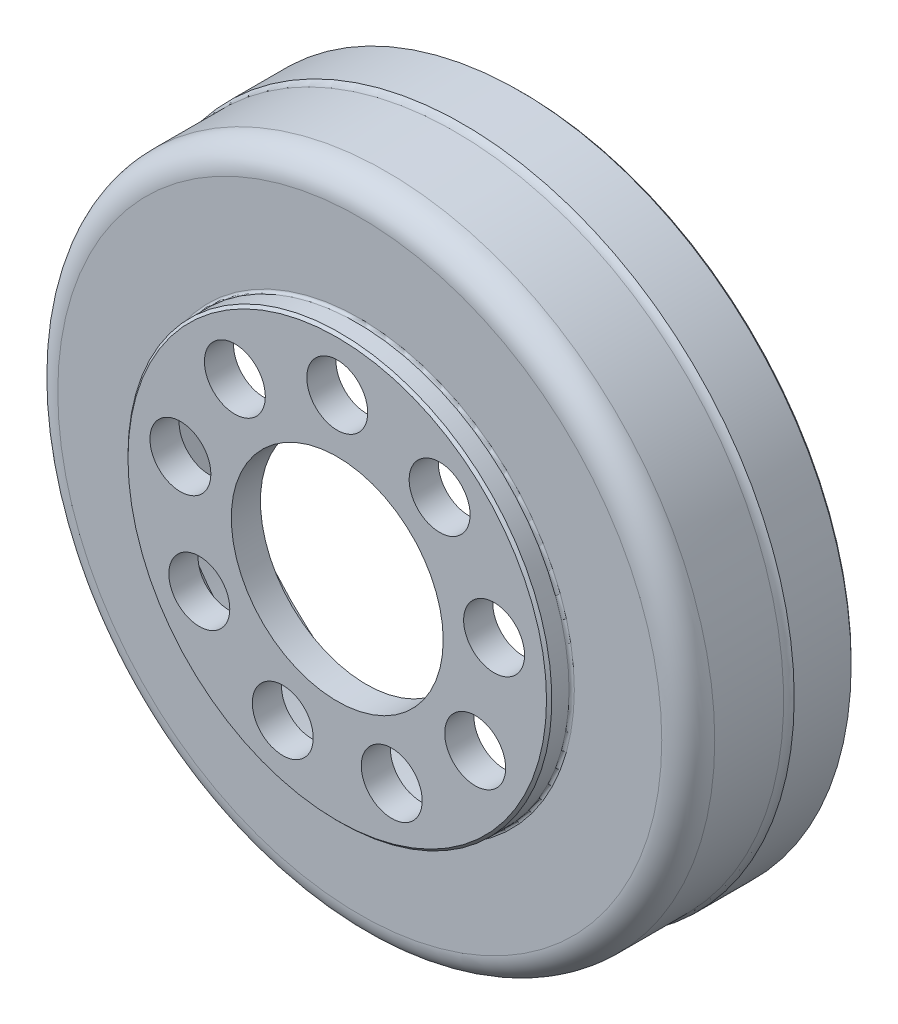
ISO-10303-21;
HEADER;
FILE_DESCRIPTION(('STEP AP214'),'2;1');
FILE_NAME('part.step','',(''),(''),'','','');
FILE_SCHEMA(('AUTOMOTIVE_DESIGN { 1 0 10303 214 1 1 1 1 }'));
ENDSEC;
DATA;
#1=APPLICATION_CONTEXT('core data for automotive mechanical design processes');
#2=APPLICATION_PROTOCOL_DEFINITION('international standard','automotive_design',2000,#1);
#3=PRODUCT_CONTEXT('',#1,'mechanical');
#4=PRODUCT('Part','Part','',(#3));
#5=PRODUCT_RELATED_PRODUCT_CATEGORY('part','',(#4));
#6=PRODUCT_DEFINITION_FORMATION('','',#4);
#7=PRODUCT_DEFINITION_CONTEXT('part definition',#1,'design');
#8=PRODUCT_DEFINITION('design','',#6,#7);
#9=PRODUCT_DEFINITION_SHAPE('','',#8);
#10=(LENGTH_UNIT() NAMED_UNIT(*) SI_UNIT(.MILLI.,.METRE.));
#11=(NAMED_UNIT(*) PLANE_ANGLE_UNIT() SI_UNIT($,.RADIAN.));
#12=(NAMED_UNIT(*) SI_UNIT($,.STERADIAN.) SOLID_ANGLE_UNIT());
#13=UNCERTAINTY_MEASURE_WITH_UNIT(LENGTH_MEASURE(1.E-05),#10,'distance_accuracy_value','');
#14=(GEOMETRIC_REPRESENTATION_CONTEXT(3) GLOBAL_UNCERTAINTY_ASSIGNED_CONTEXT((#13)) GLOBAL_UNIT_ASSIGNED_CONTEXT((#10,
#11,#12)) REPRESENTATION_CONTEXT('',''));
#15=CARTESIAN_POINT('',(0.,0.,0.));
#16=DIRECTION('',(0.,0.,1.));
#17=DIRECTION('',(1.,0.,0.));
#18=AXIS2_PLACEMENT_3D('',#15,#16,#17);
#19=CARTESIAN_POINT('',(0.,0.,4.5));
#20=DIRECTION('',(0.,0.,-1.));
#21=DIRECTION('',(-1.,0.,0.));
#22=AXIS2_PLACEMENT_3D('',#19,#20,#21);
#23=CYLINDRICAL_SURFACE('',#22,25.);
#24=CARTESIAN_POINT('',(0.,0.,0.199999999999995));
#25=DIRECTION('',(0.,0.,1.));
#26=DIRECTION('',(1.,0.,0.));
#27=AXIS2_PLACEMENT_3D('',#24,#25,#26);
#28=CIRCLE('',#27,25.);
#29=CARTESIAN_POINT('',(25.,0.,0.199999999999995));
#30=VERTEX_POINT('',#29);
#31=EDGE_CURVE('E55',#30,#30,#28,.T.);
#32=ORIENTED_EDGE('',*,*,#31,.T.);
#33=EDGE_LOOP('',(#32));
#34=FACE_BOUND('',#33,.T.);
#35=CARTESIAN_POINT('',(0.,0.,4.5));
#36=DIRECTION('',(0.,0.,1.));
#37=DIRECTION('',(1.,0.,0.));
#38=AXIS2_PLACEMENT_3D('',#35,#36,#37);
#39=CIRCLE('',#38,25.);
#40=CARTESIAN_POINT('',(25.,0.,4.5));
#41=VERTEX_POINT('',#40);
#42=EDGE_CURVE('E67',#41,#41,#39,.T.);
#43=ORIENTED_EDGE('',*,*,#42,.F.);
#44=EDGE_LOOP('',(#43));
#45=FACE_BOUND('',#44,.T.);
#46=ADVANCED_FACE('F32',(#34,#45),#23,.T.);
#47=CARTESIAN_POINT('',(0.,0.,0.));
#48=DIRECTION('',(0.,0.,1.));
#49=DIRECTION('',(1.,0.,0.));
#50=AXIS2_PLACEMENT_3D('',#47,#48,#49);
#51=PLANE('',#50);
#52=CARTESIAN_POINT('',(0.,0.,0.));
#53=DIRECTION('',(0.,0.,1.));
#54=DIRECTION('',(1.,0.,0.));
#55=AXIS2_PLACEMENT_3D('',#52,#53,#54);
#56=CIRCLE('',#55,24.8);
#57=CARTESIAN_POINT('',(24.8,0.,0.));
#58=VERTEX_POINT('',#57);
#59=EDGE_CURVE('E52',#58,#58,#56,.F.);
#60=ORIENTED_EDGE('',*,*,#59,.T.);
#61=EDGE_LOOP('',(#60));
#62=FACE_BOUND('',#61,.T.);
#63=CARTESIAN_POINT('',(0.,0.,0.));
#64=DIRECTION('',(0.,0.,1.));
#65=DIRECTION('',(1.,0.,0.));
#66=AXIS2_PLACEMENT_3D('',#63,#64,#65);
#67=CIRCLE('',#66,24.5);
#68=CARTESIAN_POINT('',(24.5,0.,0.));
#69=VERTEX_POINT('',#68);
#70=EDGE_CURVE('E71',#69,#69,#67,.T.);
#71=ORIENTED_EDGE('',*,*,#70,.T.);
#72=EDGE_LOOP('',(#71));
#73=FACE_BOUND('',#72,.T.);
#74=ADVANCED_FACE('F170',(#62,#73),#51,.F.);
#75=CARTESIAN_POINT('',(0.,0.,12.3));
#76=DIRECTION('',(0.,0.,-1.));
#77=DIRECTION('',(-1.,0.,0.));
#78=AXIS2_PLACEMENT_3D('',#75,#76,#77);
#79=CYLINDRICAL_SURFACE('',#78,24.8);
#80=CARTESIAN_POINT('',(0.,0.,5.10000000000001));
#81=DIRECTION('',(0.,0.,-1.));
#82=DIRECTION('',(-1.,0.,0.));
#83=AXIS2_PLACEMENT_3D('',#80,#81,#82);
#84=CIRCLE('',#83,24.8);
#85=CARTESIAN_POINT('',(-24.8,0.,5.10000000000001));
#86=VERTEX_POINT('',#85);
#87=EDGE_CURVE('E58',#86,#86,#84,.F.);
#88=ORIENTED_EDGE('',*,*,#87,.T.);
#89=EDGE_LOOP('',(#88));
#90=FACE_BOUND('',#89,.T.);
#91=CARTESIAN_POINT('',(0.,0.,10.3));
#92=DIRECTION('',(0.,0.,1.));
#93=DIRECTION('',(1.,0.,0.));
#94=AXIS2_PLACEMENT_3D('',#91,#92,#93);
#95=CIRCLE('',#94,24.8);
#96=CARTESIAN_POINT('',(24.8,0.,10.3));
#97=VERTEX_POINT('',#96);
#98=EDGE_CURVE('E61',#97,#97,#95,.F.);
#99=ORIENTED_EDGE('',*,*,#98,.T.);
#100=EDGE_LOOP('',(#99));
#101=FACE_BOUND('',#100,.T.);
#102=ADVANCED_FACE('F176',(#90,#101),#79,.T.);
#103=CARTESIAN_POINT('',(0.,0.,12.3));
#104=DIRECTION('',(0.,0.,1.));
#105=DIRECTION('',(1.,0.,0.));
#106=AXIS2_PLACEMENT_3D('',#103,#104,#105);
#107=PLANE('',#106);
#108=CARTESIAN_POINT('',(0.,0.,12.3));
#109=DIRECTION('',(0.,0.,1.));
#110=DIRECTION('',(1.,0.,0.));
#111=AXIS2_PLACEMENT_3D('',#108,#109,#110);
#112=CIRCLE('',#111,16.2);
#113=CARTESIAN_POINT('',(16.2,0.,12.3));
#114=VERTEX_POINT('',#113);
#115=EDGE_CURVE('E10',#114,#114,#112,.F.);
#116=ORIENTED_EDGE('',*,*,#115,.T.);
#117=EDGE_LOOP('',(#116));
#118=FACE_BOUND('',#117,.T.);
#119=CARTESIAN_POINT('',(0.,0.,12.3));
#120=DIRECTION('',(0.,0.,1.));
#121=DIRECTION('',(1.,0.,0.));
#122=AXIS2_PLACEMENT_3D('',#119,#120,#121);
#123=CIRCLE('',#122,22.8);
#124=CARTESIAN_POINT('',(22.8,0.,12.3));
#125=VERTEX_POINT('',#124);
#126=EDGE_CURVE('E64',#125,#125,#123,.T.);
#127=ORIENTED_EDGE('',*,*,#126,.T.);
#128=EDGE_LOOP('',(#127));
#129=FACE_BOUND('',#128,.T.);
#130=ADVANCED_FACE('F186',(#118,#129),#107,.T.);
#131=CARTESIAN_POINT('',(0.,0.,10.3));
#132=DIRECTION('',(0.,0.,1.));
#133=DIRECTION('',(1.,0.,0.));
#134=AXIS2_PLACEMENT_3D('',#131,#132,#133);
#135=TOROIDAL_SURFACE('',#134,22.8,2.);
#136=ORIENTED_EDGE('',*,*,#98,.F.);
#137=EDGE_LOOP('',(#136));
#138=FACE_BOUND('',#137,.T.);
#139=ORIENTED_EDGE('',*,*,#126,.F.);
#140=EDGE_LOOP('',(#139));
#141=FACE_BOUND('',#140,.T.);
#142=ADVANCED_FACE('F182',(#138,#141),#135,.T.);
#143=CARTESIAN_POINT('',(0.,0.,5.10000000000001));
#144=DIRECTION('',(0.,0.,-1.));
#145=DIRECTION('',(-1.,0.,0.));
#146=AXIS2_PLACEMENT_3D('',#143,#144,#145);
#147=TOROIDAL_SURFACE('',#146,25.8,1.);
#148=ORIENTED_EDGE('',*,*,#42,.T.);
#149=EDGE_LOOP('',(#148));
#150=FACE_BOUND('',#149,.T.);
#151=ORIENTED_EDGE('',*,*,#87,.F.);
#152=EDGE_LOOP('',(#151));
#153=FACE_BOUND('',#152,.T.);
#154=ADVANCED_FACE('F185',(#150,#153),#147,.F.);
#155=CARTESIAN_POINT('',(0.,0.,4.5));
#156=DIRECTION('',(0.,0.,-1.));
#157=DIRECTION('',(-1.,0.,0.));
#158=AXIS2_PLACEMENT_3D('',#155,#156,#157);
#159=CYLINDRICAL_SURFACE('',#158,24.5);
#160=CARTESIAN_POINT('',(0.,0.,4.35166852264521));
#161=DIRECTION('',(0.,0.,1.));
#162=DIRECTION('',(1.,0.,0.));
#163=AXIS2_PLACEMENT_3D('',#160,#161,#162);
#164=CIRCLE('',#163,24.5);
#165=CARTESIAN_POINT('',(24.5,0.,4.35166852264521));
#166=VERTEX_POINT('',#165);
#167=EDGE_CURVE('E74',#166,#166,#164,.T.);
#168=ORIENTED_EDGE('',*,*,#167,.T.);
#169=EDGE_LOOP('',(#168));
#170=FACE_BOUND('',#169,.T.);
#171=ORIENTED_EDGE('',*,*,#70,.F.);
#172=EDGE_LOOP('',(#171));
#173=FACE_BOUND('',#172,.T.);
#174=ADVANCED_FACE('F189',(#170,#173),#159,.F.);
#175=CARTESIAN_POINT('',(0.,0.,12.3));
#176=DIRECTION('',(0.,0.,-1.));
#177=DIRECTION('',(-1.,0.,0.));
#178=AXIS2_PLACEMENT_3D('',#175,#176,#177);
#179=CYLINDRICAL_SURFACE('',#178,24.3);
#180=CARTESIAN_POINT('',(0.,0.,5.10000000000001));
#181=DIRECTION('',(0.,0.,-1.));
#182=DIRECTION('',(-1.,0.,0.));
#183=AXIS2_PLACEMENT_3D('',#180,#181,#182);
#184=CIRCLE('',#183,24.3);
#185=CARTESIAN_POINT('',(-24.3,0.,5.10000000000001));
#186=VERTEX_POINT('',#185);
#187=EDGE_CURVE('E70',#186,#186,#184,.F.);
#188=ORIENTED_EDGE('',*,*,#187,.F.);
#189=EDGE_LOOP('',(#188));
#190=FACE_BOUND('',#189,.T.);
#191=CARTESIAN_POINT('',(0.,0.,10.3));
#192=DIRECTION('',(0.,0.,-1.));
#193=DIRECTION('',(-1.,0.,0.));
#194=AXIS2_PLACEMENT_3D('',#191,#192,#193);
#195=CIRCLE('',#194,24.3);
#196=CARTESIAN_POINT('',(-24.3,0.,10.3));
#197=VERTEX_POINT('',#196);
#198=EDGE_CURVE('E79',#197,#197,#195,.T.);
#199=ORIENTED_EDGE('',*,*,#198,.F.);
#200=EDGE_LOOP('',(#199));
#201=FACE_BOUND('',#200,.T.);
#202=ADVANCED_FACE('F210',(#190,#201),#179,.F.);
#203=CARTESIAN_POINT('',(0.,0.,11.8));
#204=DIRECTION('',(0.,0.,1.));
#205=DIRECTION('',(1.,0.,0.));
#206=AXIS2_PLACEMENT_3D('',#203,#204,#205);
#207=PLANE('',#206);
#208=CARTESIAN_POINT('',(-11.8419795140112,2.08806049331666,11.8));
#209=DIRECTION('',(0.,0.,1.));
#210=DIRECTION('',(1.,0.,0.));
#211=AXIS2_PLACEMENT_3D('',#208,#209,#210);
#212=CIRCLE('',#211,2.30000000000067);
#213=CARTESIAN_POINT('',(-9.54197951401057,2.08806049331666,11.8));
#214=VERTEX_POINT('',#213);
#215=EDGE_CURVE('E75',#214,#214,#212,.T.);
#216=ORIENTED_EDGE('',*,*,#215,.T.);
#217=EDGE_LOOP('',(#216));
#218=FACE_BOUND('',#217,.T.);
#219=CARTESIAN_POINT('',(-10.4136620156169,-6.01233056796708,11.8));
#220=DIRECTION('',(0.,0.,1.));
#221=DIRECTION('',(1.,0.,0.));
#222=AXIS2_PLACEMENT_3D('',#219,#220,#221);
#223=CIRCLE('',#222,2.30000000000097);
#224=CARTESIAN_POINT('',(-8.11366201561591,-6.01233056796708,11.8));
#225=VERTEX_POINT('',#224);
#226=EDGE_CURVE('E88',#225,#225,#223,.T.);
#227=ORIENTED_EDGE('',*,*,#226,.T.);
#228=EDGE_LOOP('',(#227));
#229=FACE_BOUND('',#228,.T.);
#230=CARTESIAN_POINT('',(-4.1126763251535,-11.2994853368878,11.8));
#231=DIRECTION('',(0.,0.,1.));
#232=DIRECTION('',(1.,0.,0.));
#233=AXIS2_PLACEMENT_3D('',#230,#231,#232);
#234=CIRCLE('',#233,2.30000000000109);
#235=CARTESIAN_POINT('',(-1.81267632515242,-11.2994853368878,11.8));
#236=VERTEX_POINT('',#235);
#237=EDGE_CURVE('E91',#236,#236,#234,.T.);
#238=ORIENTED_EDGE('',*,*,#237,.T.);
#239=EDGE_LOOP('',(#238));
#240=FACE_BOUND('',#239,.T.);
#241=CARTESIAN_POINT('',(4.11267632515548,-11.2994853368874,11.8));
#242=DIRECTION('',(0.,0.,1.));
#243=DIRECTION('',(1.,0.,0.));
#244=AXIS2_PLACEMENT_3D('',#241,#242,#243);
#245=CIRCLE('',#244,2.30000000000097);
#246=CARTESIAN_POINT('',(6.41267632515646,-11.2994853368874,11.8));
#247=VERTEX_POINT('',#246);
#248=EDGE_CURVE('E94',#247,#247,#245,.T.);
#249=ORIENTED_EDGE('',*,*,#248,.T.);
#250=EDGE_LOOP('',(#249));
#251=FACE_BOUND('',#250,.T.);
#252=CARTESIAN_POINT('',(10.4136620156184,-6.01233056796619,11.8));
#253=DIRECTION('',(0.,0.,1.));
#254=DIRECTION('',(1.,0.,0.));
#255=AXIS2_PLACEMENT_3D('',#252,#253,#254);
#256=CIRCLE('',#255,2.30000000000066);
#257=CARTESIAN_POINT('',(12.7136620156191,-6.01233056796619,11.8));
#258=VERTEX_POINT('',#257);
#259=EDGE_CURVE('E97',#258,#258,#256,.T.);
#260=ORIENTED_EDGE('',*,*,#259,.T.);
#261=EDGE_LOOP('',(#260));
#262=FACE_BOUND('',#261,.T.);
#263=CARTESIAN_POINT('',(11.8419795140121,2.08806049331768,11.8));
#264=DIRECTION('',(0.,0.,1.));
#265=DIRECTION('',(1.,0.,0.));
#266=AXIS2_PLACEMENT_3D('',#263,#264,#265);
#267=CIRCLE('',#266,2.30000000000029);
#268=CARTESIAN_POINT('',(14.1419795140124,2.08806049331768,11.8));
#269=VERTEX_POINT('',#268);
#270=EDGE_CURVE('E100',#269,#269,#267,.T.);
#271=ORIENTED_EDGE('',*,*,#270,.T.);
#272=EDGE_LOOP('',(#271));
#273=FACE_BOUND('',#272,.T.);
#274=CARTESIAN_POINT('',(7.72930318885729,9.21142484357074,11.8));
#275=DIRECTION('',(0.,0.,1.));
#276=DIRECTION('',(1.,0.,0.));
#277=AXIS2_PLACEMENT_3D('',#274,#275,#276);
#278=CIRCLE('',#277,2.30000000000004);
#279=CARTESIAN_POINT('',(10.0293031888573,9.21142484357074,11.8));
#280=VERTEX_POINT('',#279);
#281=EDGE_CURVE('E103',#280,#280,#278,.T.);
#282=ORIENTED_EDGE('',*,*,#281,.T.);
#283=EDGE_LOOP('',(#282));
#284=FACE_BOUND('',#283,.T.);
#285=CARTESIAN_POINT('',(0.,12.0246611359333,11.8));
#286=DIRECTION('',(0.,0.,1.));
#287=DIRECTION('',(1.,0.,0.));
#288=AXIS2_PLACEMENT_3D('',#285,#286,#287);
#289=CIRCLE('',#288,2.3);
#290=CARTESIAN_POINT('',(2.3,12.0246611359333,11.8));
#291=VERTEX_POINT('',#290);
#292=EDGE_CURVE('E106',#291,#291,#289,.T.);
#293=ORIENTED_EDGE('',*,*,#292,.T.);
#294=EDGE_LOOP('',(#293));
#295=FACE_BOUND('',#294,.T.);
#296=CARTESIAN_POINT('',(-7.72930318885705,9.21142484357008,11.8));
#297=DIRECTION('',(0.,0.,1.));
#298=DIRECTION('',(1.,0.,0.));
#299=AXIS2_PLACEMENT_3D('',#296,#297,#298);
#300=CIRCLE('',#299,2.30000000000036);
#301=CARTESIAN_POINT('',(-5.42930318885669,9.21142484357008,11.8));
#302=VERTEX_POINT('',#301);
#303=EDGE_CURVE('E109',#302,#302,#300,.T.);
#304=ORIENTED_EDGE('',*,*,#303,.T.);
#305=EDGE_LOOP('',(#304));
#306=FACE_BOUND('',#305,.T.);
#307=CARTESIAN_POINT('',(0.,0.,11.8));
#308=DIRECTION('',(0.,0.,1.));
#309=DIRECTION('',(1.,0.,0.));
#310=AXIS2_PLACEMENT_3D('',#307,#308,#309);
#311=CIRCLE('',#310,8.);
#312=CARTESIAN_POINT('',(8.,0.,11.8));
#313=VERTEX_POINT('',#312);
#314=EDGE_CURVE('E112',#313,#313,#311,.T.);
#315=ORIENTED_EDGE('',*,*,#314,.T.);
#316=EDGE_LOOP('',(#315));
#317=FACE_BOUND('',#316,.T.);
#318=CARTESIAN_POINT('',(0.,0.,11.8));
#319=DIRECTION('',(0.,0.,1.));
#320=DIRECTION('',(1.,0.,0.));
#321=AXIS2_PLACEMENT_3D('',#318,#319,#320);
#322=CIRCLE('',#321,22.8);
#323=CARTESIAN_POINT('',(22.8,0.,11.8));
#324=VERTEX_POINT('',#323);
#325=EDGE_CURVE('E76',#324,#324,#322,.T.);
#326=ORIENTED_EDGE('',*,*,#325,.F.);
#327=EDGE_LOOP('',(#326));
#328=FACE_BOUND('',#327,.T.);
#329=ADVANCED_FACE('F216',(#218,#229,#240,#251,#262,#273,#284,#295,#306,#317,#328),#207,.F.);
#330=CARTESIAN_POINT('',(0.,0.,10.3));
#331=DIRECTION('',(0.,0.,1.));
#332=DIRECTION('',(1.,0.,0.));
#333=AXIS2_PLACEMENT_3D('',#330,#331,#332);
#334=TOROIDAL_SURFACE('',#333,22.8,1.5);
#335=ORIENTED_EDGE('',*,*,#198,.T.);
#336=EDGE_LOOP('',(#335));
#337=FACE_BOUND('',#336,.T.);
#338=ORIENTED_EDGE('',*,*,#325,.T.);
#339=EDGE_LOOP('',(#338));
#340=FACE_BOUND('',#339,.T.);
#341=ADVANCED_FACE('F200',(#337,#340),#334,.F.);
#342=CARTESIAN_POINT('',(0.,0.,5.10000000000001));
#343=DIRECTION('',(0.,0.,-1.));
#344=DIRECTION('',(-1.,0.,0.));
#345=AXIS2_PLACEMENT_3D('',#342,#343,#344);
#346=TOROIDAL_SURFACE('',#345,25.8,1.5);
#347=ORIENTED_EDGE('',*,*,#167,.F.);
#348=EDGE_LOOP('',(#347));
#349=FACE_BOUND('',#348,.T.);
#350=ORIENTED_EDGE('',*,*,#187,.T.);
#351=EDGE_LOOP('',(#350));
#352=FACE_BOUND('',#351,.T.);
#353=ADVANCED_FACE('F193',(#349,#352),#346,.T.);
#354=CARTESIAN_POINT('',(0.,0.,0.199999999999995));
#355=DIRECTION('',(0.,0.,1.));
#356=DIRECTION('',(1.,0.,0.));
#357=AXIS2_PLACEMENT_3D('',#354,#355,#356);
#358=CONICAL_SURFACE('',#357,25.,0.785398163397448);
#359=ORIENTED_EDGE('',*,*,#59,.F.);
#360=EDGE_LOOP('',(#359));
#361=FACE_BOUND('',#360,.T.);
#362=ORIENTED_EDGE('',*,*,#31,.F.);
#363=EDGE_LOOP('',(#362));
#364=FACE_BOUND('',#363,.T.);
#365=ADVANCED_FACE('F191',(#361,#364),#358,.T.);
#366=CARTESIAN_POINT('',(0.,0.,14.));
#367=DIRECTION('',(0.,0.,-1.));
#368=DIRECTION('',(-1.,0.,0.));
#369=AXIS2_PLACEMENT_3D('',#366,#367,#368);
#370=CYLINDRICAL_SURFACE('',#369,16.);
#371=CARTESIAN_POINT('',(0.,0.,12.5));
#372=DIRECTION('',(0.,0.,1.));
#373=DIRECTION('',(1.,0.,0.));
#374=AXIS2_PLACEMENT_3D('',#371,#372,#373);
#375=CIRCLE('',#374,16.);
#376=CARTESIAN_POINT('',(16.,0.,12.5));
#377=VERTEX_POINT('',#376);
#378=EDGE_CURVE('E39',#377,#377,#375,.T.);
#379=ORIENTED_EDGE('',*,*,#378,.T.);
#380=EDGE_LOOP('',(#379));
#381=FACE_BOUND('',#380,.T.);
#382=CARTESIAN_POINT('',(0.,0.,13.8));
#383=DIRECTION('',(0.,0.,1.));
#384=DIRECTION('',(1.,0.,0.));
#385=AXIS2_PLACEMENT_3D('',#382,#383,#384);
#386=CIRCLE('',#385,16.);
#387=CARTESIAN_POINT('',(-16.,0.,13.8));
#388=VERTEX_POINT('',#387);
#389=EDGE_CURVE('E43',#388,#388,#386,.F.);
#390=ORIENTED_EDGE('',*,*,#389,.T.);
#391=EDGE_LOOP('',(#390));
#392=FACE_BOUND('',#391,.T.);
#393=ADVANCED_FACE('F153',(#381,#392),#370,.T.);
#394=CARTESIAN_POINT('',(0.,0.,14.));
#395=DIRECTION('',(0.,0.,1.));
#396=DIRECTION('',(1.,0.,0.));
#397=AXIS2_PLACEMENT_3D('',#394,#395,#396);
#398=PLANE('',#397);
#399=CARTESIAN_POINT('',(-11.8419795140112,2.08806049331666,14.));
#400=DIRECTION('',(0.,0.,1.));
#401=DIRECTION('',(1.,0.,0.));
#402=AXIS2_PLACEMENT_3D('',#399,#400,#401);
#403=CIRCLE('',#402,2.30000000000067);
#404=CARTESIAN_POINT('',(-9.54197951401057,2.08806049331666,14.));
#405=VERTEX_POINT('',#404);
#406=EDGE_CURVE('E131',#405,#405,#403,.T.);
#407=ORIENTED_EDGE('',*,*,#406,.F.);
#408=EDGE_LOOP('',(#407));
#409=FACE_BOUND('',#408,.T.);
#410=CARTESIAN_POINT('',(-10.4136620156169,-6.01233056796708,14.));
#411=DIRECTION('',(0.,0.,1.));
#412=DIRECTION('',(1.,0.,0.));
#413=AXIS2_PLACEMENT_3D('',#410,#411,#412);
#414=CIRCLE('',#413,2.30000000000097);
#415=CARTESIAN_POINT('',(-8.11366201561591,-6.01233056796708,14.));
#416=VERTEX_POINT('',#415);
#417=EDGE_CURVE('E134',#416,#416,#414,.T.);
#418=ORIENTED_EDGE('',*,*,#417,.F.);
#419=EDGE_LOOP('',(#418));
#420=FACE_BOUND('',#419,.T.);
#421=CARTESIAN_POINT('',(-4.1126763251535,-11.2994853368878,14.));
#422=DIRECTION('',(0.,0.,1.));
#423=DIRECTION('',(1.,0.,0.));
#424=AXIS2_PLACEMENT_3D('',#421,#422,#423);
#425=CIRCLE('',#424,2.30000000000109);
#426=CARTESIAN_POINT('',(-1.81267632515242,-11.2994853368878,14.));
#427=VERTEX_POINT('',#426);
#428=EDGE_CURVE('E138',#427,#427,#425,.T.);
#429=ORIENTED_EDGE('',*,*,#428,.F.);
#430=EDGE_LOOP('',(#429));
#431=FACE_BOUND('',#430,.T.);
#432=CARTESIAN_POINT('',(4.11267632515548,-11.2994853368874,14.));
#433=DIRECTION('',(0.,0.,1.));
#434=DIRECTION('',(1.,0.,0.));
#435=AXIS2_PLACEMENT_3D('',#432,#433,#434);
#436=CIRCLE('',#435,2.30000000000097);
#437=CARTESIAN_POINT('',(6.41267632515646,-11.2994853368874,14.));
#438=VERTEX_POINT('',#437);
#439=EDGE_CURVE('E123',#438,#438,#436,.T.);
#440=ORIENTED_EDGE('',*,*,#439,.F.);
#441=EDGE_LOOP('',(#440));
#442=FACE_BOUND('',#441,.T.);
#443=CARTESIAN_POINT('',(10.4136620156184,-6.01233056796619,14.));
#444=DIRECTION('',(0.,0.,1.));
#445=DIRECTION('',(1.,0.,0.));
#446=AXIS2_PLACEMENT_3D('',#443,#444,#445);
#447=CIRCLE('',#446,2.30000000000066);
#448=CARTESIAN_POINT('',(12.7136620156191,-6.01233056796619,14.));
#449=VERTEX_POINT('',#448);
#450=EDGE_CURVE('E119',#449,#449,#447,.T.);
#451=ORIENTED_EDGE('',*,*,#450,.F.);
#452=EDGE_LOOP('',(#451));
#453=FACE_BOUND('',#452,.T.);
#454=CARTESIAN_POINT('',(11.8419795140121,2.08806049331768,14.));
#455=DIRECTION('',(0.,0.,1.));
#456=DIRECTION('',(1.,0.,0.));
#457=AXIS2_PLACEMENT_3D('',#454,#455,#456);
#458=CIRCLE('',#457,2.30000000000029);
#459=CARTESIAN_POINT('',(14.1419795140124,2.08806049331768,14.));
#460=VERTEX_POINT('',#459);
#461=EDGE_CURVE('E122',#460,#460,#458,.T.);
#462=ORIENTED_EDGE('',*,*,#461,.F.);
#463=EDGE_LOOP('',(#462));
#464=FACE_BOUND('',#463,.T.);
#465=CARTESIAN_POINT('',(7.72930318885729,9.21142484357074,14.));
#466=DIRECTION('',(0.,0.,1.));
#467=DIRECTION('',(1.,0.,0.));
#468=AXIS2_PLACEMENT_3D('',#465,#466,#467);
#469=CIRCLE('',#468,2.30000000000004);
#470=CARTESIAN_POINT('',(10.0293031888573,9.21142484357074,14.));
#471=VERTEX_POINT('',#470);
#472=EDGE_CURVE('E126',#471,#471,#469,.T.);
#473=ORIENTED_EDGE('',*,*,#472,.F.);
#474=EDGE_LOOP('',(#473));
#475=FACE_BOUND('',#474,.T.);
#476=CARTESIAN_POINT('',(0.,12.0246611359333,14.));
#477=DIRECTION('',(0.,0.,1.));
#478=DIRECTION('',(1.,0.,0.));
#479=AXIS2_PLACEMENT_3D('',#476,#477,#478);
#480=CIRCLE('',#479,2.3);
#481=CARTESIAN_POINT('',(2.3,12.0246611359333,14.));
#482=VERTEX_POINT('',#481);
#483=EDGE_CURVE('E118',#482,#482,#480,.T.);
#484=ORIENTED_EDGE('',*,*,#483,.F.);
#485=EDGE_LOOP('',(#484));
#486=FACE_BOUND('',#485,.T.);
#487=CARTESIAN_POINT('',(-7.72930318885705,9.21142484357008,14.));
#488=DIRECTION('',(0.,0.,1.));
#489=DIRECTION('',(1.,0.,0.));
#490=AXIS2_PLACEMENT_3D('',#487,#488,#489);
#491=CIRCLE('',#490,2.30000000000036);
#492=CARTESIAN_POINT('',(-5.42930318885669,9.21142484357008,14.));
#493=VERTEX_POINT('',#492);
#494=EDGE_CURVE('E135',#493,#493,#491,.T.);
#495=ORIENTED_EDGE('',*,*,#494,.F.);
#496=EDGE_LOOP('',(#495));
#497=FACE_BOUND('',#496,.T.);
#498=CARTESIAN_POINT('',(0.,0.,14.));
#499=DIRECTION('',(0.,0.,1.));
#500=DIRECTION('',(1.,0.,0.));
#501=AXIS2_PLACEMENT_3D('',#498,#499,#500);
#502=CIRCLE('',#501,8.);
#503=CARTESIAN_POINT('',(8.,0.,14.));
#504=VERTEX_POINT('',#503);
#505=EDGE_CURVE('E115',#504,#504,#502,.T.);
#506=ORIENTED_EDGE('',*,*,#505,.F.);
#507=EDGE_LOOP('',(#506));
#508=FACE_BOUND('',#507,.T.);
#509=CARTESIAN_POINT('',(0.,0.,14.));
#510=DIRECTION('',(0.,0.,1.));
#511=DIRECTION('',(1.,0.,0.));
#512=AXIS2_PLACEMENT_3D('',#509,#510,#511);
#513=CIRCLE('',#512,15.8);
#514=CARTESIAN_POINT('',(-15.8,0.,14.));
#515=VERTEX_POINT('',#514);
#516=EDGE_CURVE('E47',#515,#515,#513,.T.);
#517=ORIENTED_EDGE('',*,*,#516,.T.);
#518=EDGE_LOOP('',(#517));
#519=FACE_BOUND('',#518,.T.);
#520=ADVANCED_FACE('F149',(#409,#420,#431,#442,#453,#464,#475,#486,#497,#508,#519),#398,.T.);
#521=CARTESIAN_POINT('',(0.,0.,14.));
#522=DIRECTION('',(0.,0.,-1.));
#523=DIRECTION('',(-1.,0.,0.));
#524=AXIS2_PLACEMENT_3D('',#521,#522,#523);
#525=CONICAL_SURFACE('',#524,15.8,0.785398163397483);
#526=CARTESIAN_POINT('',(-16.,0.,13.8));
#527=CARTESIAN_POINT('',(-15.9979166666667,0.,13.8020833333334));
#528=CARTESIAN_POINT('',(-15.9958333333333,0.,13.8041666666667));
#529=CARTESIAN_POINT('',(-15.9916666666667,0.,13.8083333333334));
#530=CARTESIAN_POINT('',(-15.9895833333333,0.,13.8104166666667));
#531=CARTESIAN_POINT('',(-15.9854166666667,0.,13.8145833333334));
#532=CARTESIAN_POINT('',(-15.9833333333333,0.,13.8166666666667));
#533=CARTESIAN_POINT('',(-15.9791666666667,0.,13.8208333333334));
#534=CARTESIAN_POINT('',(-15.9770833333333,0.,13.8229166666667));
#535=CARTESIAN_POINT('',(-15.9729166666667,0.,13.8270833333334));
#536=CARTESIAN_POINT('',(-15.9708333333333,0.,13.8291666666667));
#537=CARTESIAN_POINT('',(-15.9666666666667,0.,13.8333333333334));
#538=CARTESIAN_POINT('',(-15.9645833333333,0.,13.8354166666667));
#539=CARTESIAN_POINT('',(-15.9604166666667,0.,13.8395833333334));
#540=CARTESIAN_POINT('',(-15.9583333333333,0.,13.8416666666667));
#541=CARTESIAN_POINT('',(-15.9541666666667,0.,13.8458333333334));
#542=CARTESIAN_POINT('',(-15.9520833333333,0.,13.8479166666667));
#543=CARTESIAN_POINT('',(-15.9479166666667,0.,13.8520833333334));
#544=CARTESIAN_POINT('',(-15.9458333333333,0.,13.8541666666667));
#545=CARTESIAN_POINT('',(-15.9416666666667,0.,13.8583333333333));
#546=CARTESIAN_POINT('',(-15.9395833333333,0.,13.8604166666667));
#547=CARTESIAN_POINT('',(-15.9354166666667,0.,13.8645833333333));
#548=CARTESIAN_POINT('',(-15.9333333333333,0.,13.8666666666667));
#549=CARTESIAN_POINT('',(-15.9291666666667,0.,13.8708333333333));
#550=CARTESIAN_POINT('',(-15.9270833333333,0.,13.8729166666667));
#551=CARTESIAN_POINT('',(-15.9229166666667,0.,13.8770833333333));
#552=CARTESIAN_POINT('',(-15.9208333333333,0.,13.8791666666667));
#553=CARTESIAN_POINT('',(-15.9166666666667,0.,13.8833333333333));
#554=CARTESIAN_POINT('',(-15.9145833333333,0.,13.8854166666667));
#555=CARTESIAN_POINT('',(-15.9104166666667,0.,13.8895833333333));
#556=CARTESIAN_POINT('',(-15.9083333333333,0.,13.8916666666667));
#557=CARTESIAN_POINT('',(-15.9041666666667,0.,13.8958333333333));
#558=CARTESIAN_POINT('',(-15.9020833333333,0.,13.8979166666667));
#559=CARTESIAN_POINT('',(-15.8979166666667,0.,13.9020833333333));
#560=CARTESIAN_POINT('',(-15.8958333333333,0.,13.9041666666667));
#561=CARTESIAN_POINT('',(-15.8916666666667,0.,13.9083333333333));
#562=CARTESIAN_POINT('',(-15.8895833333333,0.,13.9104166666667));
#563=CARTESIAN_POINT('',(-15.8854166666667,0.,13.9145833333333));
#564=CARTESIAN_POINT('',(-15.8833333333333,0.,13.9166666666667));
#565=CARTESIAN_POINT('',(-15.8791666666667,0.,13.9208333333333));
#566=CARTESIAN_POINT('',(-15.8770833333333,0.,13.9229166666667));
#567=CARTESIAN_POINT('',(-15.8729166666667,0.,13.9270833333333));
#568=CARTESIAN_POINT('',(-15.8708333333333,0.,13.9291666666667));
#569=CARTESIAN_POINT('',(-15.8666666666667,0.,13.9333333333333));
#570=CARTESIAN_POINT('',(-15.8645833333333,0.,13.9354166666667));
#571=CARTESIAN_POINT('',(-15.8604166666667,0.,13.9395833333333));
#572=CARTESIAN_POINT('',(-15.8583333333333,0.,13.9416666666667));
#573=CARTESIAN_POINT('',(-15.8541666666667,0.,13.9458333333333));
#574=CARTESIAN_POINT('',(-15.8520833333333,0.,13.9479166666667));
#575=CARTESIAN_POINT('',(-15.8479166666667,0.,13.9520833333333));
#576=CARTESIAN_POINT('',(-15.8458333333333,0.,13.9541666666667));
#577=CARTESIAN_POINT('',(-15.8416666666667,0.,13.9583333333333));
#578=CARTESIAN_POINT('',(-15.8395833333333,0.,13.9604166666667));
#579=CARTESIAN_POINT('',(-15.8354166666667,0.,13.9645833333333));
#580=CARTESIAN_POINT('',(-15.8333333333333,0.,13.9666666666667));
#581=CARTESIAN_POINT('',(-15.8291666666667,0.,13.9708333333333));
#582=CARTESIAN_POINT('',(-15.8270833333333,0.,13.9729166666667));
#583=CARTESIAN_POINT('',(-15.8229166666667,0.,13.9770833333333));
#584=CARTESIAN_POINT('',(-15.8208333333333,0.,13.9791666666667));
#585=CARTESIAN_POINT('',(-15.8166666666667,0.,13.9833333333333));
#586=CARTESIAN_POINT('',(-15.8145833333333,0.,13.9854166666667));
#587=CARTESIAN_POINT('',(-15.8104166666667,0.,13.9895833333333));
#588=CARTESIAN_POINT('',(-15.8083333333333,0.,13.9916666666667));
#589=CARTESIAN_POINT('',(-15.8041666666667,0.,13.9958333333333));
#590=CARTESIAN_POINT('',(-15.8020833333333,0.,13.9979166666667));
#591=CARTESIAN_POINT('',(-15.8,0.,14.));
#592=B_SPLINE_CURVE_WITH_KNOTS('',3,(#526,#527,#528,#529,#530,#531,#532,#533,#534,#535,#536,
#537,#538,#539,#540,#541,#542,#543,#544,#545,#546,#547,#548,#549,#550,#551,#552,#553,#554,#555,
#556,#557,#558,#559,#560,#561,#562,#563,#564,#565,#566,#567,#568,#569,#570,#571,#572,#573,#574,
#575,#576,#577,#578,#579,#580,#581,#582,#583,#584,#585,#586,#587,#588,#589,#590,#591),
.UNSPECIFIED.,.F.,.F.,(4,2,2,2,2,2,2,2,2,2,2,2,2,2,2,2,2,2,2,2,2,2,2,2,2,2,2,2,2,2,2,2,4),(0.,
0.00883883476483087,0.0176776695296617,0.0265165042944926,0.0353553390593235,0.0441941738241543,
0.0530330085889852,0.0618718433538185,0.0707106781186494,0.0795495128834803,0.0883883476483111,
0.097227182413142,0.106066017177974,0.114904851942804,0.123743686707635,0.132582521472468,
0.141421356237299,0.15026019100213,0.159099025766961,0.167937860531791,0.176776695296622,
0.185615530061453,0.194454364826284,0.203293199591117,0.21213203435595,0.22097086912078,
0.229809703885611,0.238648538650442,0.247487373415273,0.256326208180104,0.265165042944935,
0.274003877709768,0.282842712474599),.UNSPECIFIED.);
#593=EDGE_CURVE('BSEAM152',#388,#515,#592,.T.);
#594=ORIENTED_EDGE('',*,*,#389,.F.);
#595=ORIENTED_EDGE('',*,*,#516,.F.);
#596=ORIENTED_EDGE('',*,*,#593,.T.);
#597=ORIENTED_EDGE('',*,*,#593,.F.);
#598=EDGE_LOOP('',(#594,#596,#595,#597));
#599=FACE_BOUND('',#598,.T.);
#600=ADVANCED_FACE('F152',(#599),#525,.T.);
#601=CARTESIAN_POINT('',(0.,0.,12.5));
#602=DIRECTION('',(0.,0.,1.));
#603=DIRECTION('',(1.,0.,0.));
#604=AXIS2_PLACEMENT_3D('',#601,#602,#603);
#605=TOROIDAL_SURFACE('',#604,16.2,0.2);
#606=ORIENTED_EDGE('',*,*,#115,.F.);
#607=EDGE_LOOP('',(#606));
#608=FACE_BOUND('',#607,.T.);
#609=ORIENTED_EDGE('',*,*,#378,.F.);
#610=EDGE_LOOP('',(#609));
#611=FACE_BOUND('',#610,.T.);
#612=ADVANCED_FACE('F34',(#608,#611),#605,.F.);
#613=CARTESIAN_POINT('',(0.,0.,0.));
#614=DIRECTION('',(0.,0.,1.));
#615=DIRECTION('',(1.,0.,0.));
#616=AXIS2_PLACEMENT_3D('',#613,#614,#615);
#617=CYLINDRICAL_SURFACE('',#616,8.);
#618=ORIENTED_EDGE('',*,*,#505,.T.);
#619=EDGE_LOOP('',(#618));
#620=FACE_BOUND('',#619,.T.);
#621=ORIENTED_EDGE('',*,*,#314,.F.);
#622=EDGE_LOOP('',(#621));
#623=FACE_BOUND('',#622,.T.);
#624=ADVANCED_FACE('F165',(#620,#623),#617,.F.);
#625=CARTESIAN_POINT('',(-7.72930318885705,9.21142484357008,0.));
#626=DIRECTION('',(0.,0.,1.));
#627=DIRECTION('',(1.,0.,0.));
#628=AXIS2_PLACEMENT_3D('',#625,#626,#627);
#629=CYLINDRICAL_SURFACE('',#628,2.30000000000036);
#630=ORIENTED_EDGE('',*,*,#494,.T.);
#631=EDGE_LOOP('',(#630));
#632=FACE_BOUND('',#631,.T.);
#633=ORIENTED_EDGE('',*,*,#303,.F.);
#634=EDGE_LOOP('',(#633));
#635=FACE_BOUND('',#634,.T.);
#636=ADVANCED_FACE('F146',(#632,#635),#629,.F.);
#637=CARTESIAN_POINT('',(0.,12.0246611359333,0.));
#638=DIRECTION('',(0.,0.,1.));
#639=DIRECTION('',(1.,0.,0.));
#640=AXIS2_PLACEMENT_3D('',#637,#638,#639);
#641=CYLINDRICAL_SURFACE('',#640,2.3);
#642=ORIENTED_EDGE('',*,*,#483,.T.);
#643=EDGE_LOOP('',(#642));
#644=FACE_BOUND('',#643,.T.);
#645=ORIENTED_EDGE('',*,*,#292,.F.);
#646=EDGE_LOOP('',(#645));
#647=FACE_BOUND('',#646,.T.);
#648=ADVANCED_FACE('F321',(#644,#647),#641,.F.);
#649=CARTESIAN_POINT('',(7.72930318885729,9.21142484357074,0.));
#650=DIRECTION('',(0.,0.,1.));
#651=DIRECTION('',(1.,0.,0.));
#652=AXIS2_PLACEMENT_3D('',#649,#650,#651);
#653=CYLINDRICAL_SURFACE('',#652,2.30000000000004);
#654=ORIENTED_EDGE('',*,*,#472,.T.);
#655=EDGE_LOOP('',(#654));
#656=FACE_BOUND('',#655,.T.);
#657=ORIENTED_EDGE('',*,*,#281,.F.);
#658=EDGE_LOOP('',(#657));
#659=FACE_BOUND('',#658,.T.);
#660=ADVANCED_FACE('F329',(#656,#659),#653,.F.);
#661=CARTESIAN_POINT('',(11.8419795140121,2.08806049331768,0.));
#662=DIRECTION('',(0.,0.,1.));
#663=DIRECTION('',(1.,0.,0.));
#664=AXIS2_PLACEMENT_3D('',#661,#662,#663);
#665=CYLINDRICAL_SURFACE('',#664,2.30000000000029);
#666=ORIENTED_EDGE('',*,*,#461,.T.);
#667=EDGE_LOOP('',(#666));
#668=FACE_BOUND('',#667,.T.);
#669=ORIENTED_EDGE('',*,*,#270,.F.);
#670=EDGE_LOOP('',(#669));
#671=FACE_BOUND('',#670,.T.);
#672=ADVANCED_FACE('F338',(#668,#671),#665,.F.);
#673=CARTESIAN_POINT('',(10.4136620156184,-6.01233056796619,0.));
#674=DIRECTION('',(0.,0.,1.));
#675=DIRECTION('',(1.,0.,0.));
#676=AXIS2_PLACEMENT_3D('',#673,#674,#675);
#677=CYLINDRICAL_SURFACE('',#676,2.30000000000066);
#678=ORIENTED_EDGE('',*,*,#450,.T.);
#679=EDGE_LOOP('',(#678));
#680=FACE_BOUND('',#679,.T.);
#681=ORIENTED_EDGE('',*,*,#259,.F.);
#682=EDGE_LOOP('',(#681));
#683=FACE_BOUND('',#682,.T.);
#684=ADVANCED_FACE('F347',(#680,#683),#677,.F.);
#685=CARTESIAN_POINT('',(4.11267632515548,-11.2994853368874,0.));
#686=DIRECTION('',(0.,0.,1.));
#687=DIRECTION('',(1.,0.,0.));
#688=AXIS2_PLACEMENT_3D('',#685,#686,#687);
#689=CYLINDRICAL_SURFACE('',#688,2.30000000000097);
#690=ORIENTED_EDGE('',*,*,#439,.T.);
#691=EDGE_LOOP('',(#690));
#692=FACE_BOUND('',#691,.T.);
#693=ORIENTED_EDGE('',*,*,#248,.F.);
#694=EDGE_LOOP('',(#693));
#695=FACE_BOUND('',#694,.T.);
#696=ADVANCED_FACE('F356',(#692,#695),#689,.F.);
#697=CARTESIAN_POINT('',(-4.1126763251535,-11.2994853368878,0.));
#698=DIRECTION('',(0.,0.,1.));
#699=DIRECTION('',(1.,0.,0.));
#700=AXIS2_PLACEMENT_3D('',#697,#698,#699);
#701=CYLINDRICAL_SURFACE('',#700,2.30000000000109);
#702=ORIENTED_EDGE('',*,*,#428,.T.);
#703=EDGE_LOOP('',(#702));
#704=FACE_BOUND('',#703,.T.);
#705=ORIENTED_EDGE('',*,*,#237,.F.);
#706=EDGE_LOOP('',(#705));
#707=FACE_BOUND('',#706,.T.);
#708=ADVANCED_FACE('F365',(#704,#707),#701,.F.);
#709=CARTESIAN_POINT('',(-10.4136620156169,-6.01233056796708,0.));
#710=DIRECTION('',(0.,0.,1.));
#711=DIRECTION('',(1.,0.,0.));
#712=AXIS2_PLACEMENT_3D('',#709,#710,#711);
#713=CYLINDRICAL_SURFACE('',#712,2.30000000000097);
#714=ORIENTED_EDGE('',*,*,#417,.T.);
#715=EDGE_LOOP('',(#714));
#716=FACE_BOUND('',#715,.T.);
#717=ORIENTED_EDGE('',*,*,#226,.F.);
#718=EDGE_LOOP('',(#717));
#719=FACE_BOUND('',#718,.T.);
#720=ADVANCED_FACE('F374',(#716,#719),#713,.F.);
#721=CARTESIAN_POINT('',(-11.8419795140112,2.08806049331666,0.));
#722=DIRECTION('',(0.,0.,1.));
#723=DIRECTION('',(1.,0.,0.));
#724=AXIS2_PLACEMENT_3D('',#721,#722,#723);
#725=CYLINDRICAL_SURFACE('',#724,2.30000000000067);
#726=ORIENTED_EDGE('',*,*,#406,.T.);
#727=EDGE_LOOP('',(#726));
#728=FACE_BOUND('',#727,.T.);
#729=ORIENTED_EDGE('',*,*,#215,.F.);
#730=EDGE_LOOP('',(#729));
#731=FACE_BOUND('',#730,.T.);
#732=ADVANCED_FACE('F383',(#728,#731),#725,.F.);
#733=CLOSED_SHELL('',(#46,#74,#102,#130,#142,#154,#174,#202,#329,#341,#353,#365,#393,#520,#600,
#612,#624,#636,#648,#660,#672,#684,#696,#708,#720,#732));
#734=MANIFOLD_SOLID_BREP('B2',#733);
#735=ADVANCED_BREP_SHAPE_REPRESENTATION('',(#18,#734),#14);
#736=SHAPE_DEFINITION_REPRESENTATION(#9,#735);
ENDSEC;
END-ISO-10303-21;
